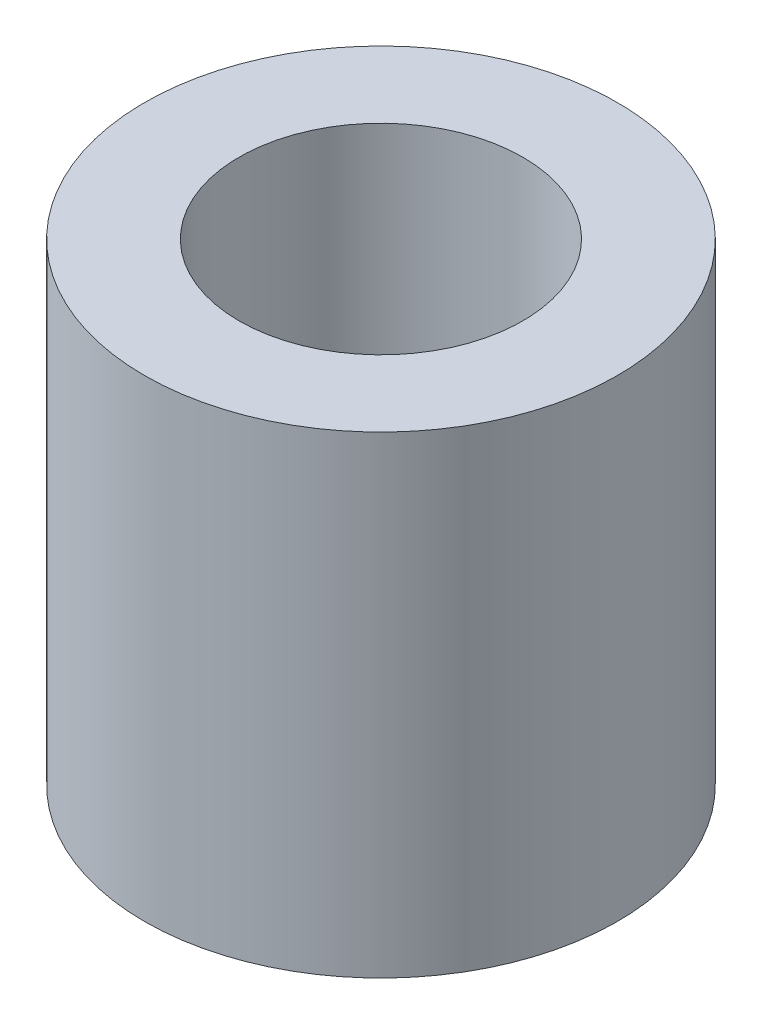
ISO-10303-21;
HEADER;
FILE_DESCRIPTION(('STEP AP214'),'2;1');
FILE_NAME('part.step','',(''),(''),'','','');
FILE_SCHEMA(('AUTOMOTIVE_DESIGN { 1 0 10303 214 1 1 1 1 }'));
ENDSEC;
DATA;
#1=APPLICATION_CONTEXT('core data for automotive mechanical design processes');
#2=APPLICATION_PROTOCOL_DEFINITION('international standard','automotive_design',2000,#1);
#3=PRODUCT_CONTEXT('',#1,'mechanical');
#4=PRODUCT('Part','Part','',(#3));
#5=PRODUCT_RELATED_PRODUCT_CATEGORY('part','',(#4));
#6=PRODUCT_DEFINITION_FORMATION('','',#4);
#7=PRODUCT_DEFINITION_CONTEXT('part definition',#1,'design');
#8=PRODUCT_DEFINITION('design','',#6,#7);
#9=PRODUCT_DEFINITION_SHAPE('','',#8);
#10=(LENGTH_UNIT() NAMED_UNIT(*) SI_UNIT(.MILLI.,.METRE.));
#11=(NAMED_UNIT(*) PLANE_ANGLE_UNIT() SI_UNIT($,.RADIAN.));
#12=(NAMED_UNIT(*) SI_UNIT($,.STERADIAN.) SOLID_ANGLE_UNIT());
#13=UNCERTAINTY_MEASURE_WITH_UNIT(LENGTH_MEASURE(1.E-05),#10,'distance_accuracy_value','');
#14=(GEOMETRIC_REPRESENTATION_CONTEXT(3) GLOBAL_UNCERTAINTY_ASSIGNED_CONTEXT((#13)) GLOBAL_UNIT_ASSIGNED_CONTEXT((#10,
#11,#12)) REPRESENTATION_CONTEXT('',''));
#15=CARTESIAN_POINT('',(0.,0.,0.));
#16=DIRECTION('',(0.,0.,1.));
#17=DIRECTION('',(1.,0.,0.));
#18=AXIS2_PLACEMENT_3D('',#15,#16,#17);
#19=CARTESIAN_POINT('',(0.,2.5,0.));
#20=DIRECTION('',(0.,1.,0.));
#21=DIRECTION('',(0.,0.,1.));
#22=AXIS2_PLACEMENT_3D('',#19,#20,#21);
#23=PLANE('',#22);
#24=CARTESIAN_POINT('',(0.,2.5,0.));
#25=DIRECTION('',(0.,1.,0.));
#26=DIRECTION('',(0.,0.,1.));
#27=AXIS2_PLACEMENT_3D('',#24,#25,#26);
#28=CIRCLE('',#27,2.5);
#29=CARTESIAN_POINT('',(0.,2.5,2.5));
#30=VERTEX_POINT('',#29);
#31=EDGE_CURVE('E10',#30,#30,#28,.T.);
#32=ORIENTED_EDGE('',*,*,#31,.T.);
#33=EDGE_LOOP('',(#32));
#34=FACE_BOUND('',#33,.T.);
#35=CARTESIAN_POINT('',(0.,2.5,0.));
#36=DIRECTION('',(0.,1.,0.));
#37=DIRECTION('',(0.,0.,1.));
#38=AXIS2_PLACEMENT_3D('',#35,#36,#37);
#39=CIRCLE('',#38,1.5);
#40=CARTESIAN_POINT('',(0.,2.5,1.5));
#41=VERTEX_POINT('',#40);
#42=EDGE_CURVE('E41',#41,#41,#39,.T.);
#43=ORIENTED_EDGE('',*,*,#42,.F.);
#44=EDGE_LOOP('',(#43));
#45=FACE_BOUND('',#44,.T.);
#46=ADVANCED_FACE('F30',(#34,#45),#23,.T.);
#47=CARTESIAN_POINT('',(0.,-2.5,0.));
#48=DIRECTION('',(0.,1.,0.));
#49=DIRECTION('',(0.,0.,1.));
#50=AXIS2_PLACEMENT_3D('',#47,#48,#49);
#51=PLANE('',#50);
#52=CARTESIAN_POINT('',(0.,-2.5,0.));
#53=DIRECTION('',(0.,1.,0.));
#54=DIRECTION('',(0.,0.,1.));
#55=AXIS2_PLACEMENT_3D('',#52,#53,#54);
#56=CIRCLE('',#55,2.5);
#57=CARTESIAN_POINT('',(0.,-2.5,2.5));
#58=VERTEX_POINT('',#57);
#59=EDGE_CURVE('E34',#58,#58,#56,.T.);
#60=ORIENTED_EDGE('',*,*,#59,.F.);
#61=EDGE_LOOP('',(#60));
#62=FACE_BOUND('',#61,.T.);
#63=CARTESIAN_POINT('',(0.,-2.5,0.));
#64=DIRECTION('',(0.,1.,0.));
#65=DIRECTION('',(0.,0.,1.));
#66=AXIS2_PLACEMENT_3D('',#63,#64,#65);
#67=CIRCLE('',#66,1.5);
#68=CARTESIAN_POINT('',(0.,-2.5,1.5));
#69=VERTEX_POINT('',#68);
#70=EDGE_CURVE('E43',#69,#69,#67,.T.);
#71=ORIENTED_EDGE('',*,*,#70,.T.);
#72=EDGE_LOOP('',(#71));
#73=FACE_BOUND('',#72,.T.);
#74=ADVANCED_FACE('F53',(#62,#73),#51,.F.);
#75=CARTESIAN_POINT('',(0.,2.5,0.));
#76=DIRECTION('',(0.,-1.,0.));
#77=DIRECTION('',(0.,0.,-1.));
#78=AXIS2_PLACEMENT_3D('',#75,#76,#77);
#79=CYLINDRICAL_SURFACE('',#78,2.5);
#80=ORIENTED_EDGE('',*,*,#31,.F.);
#81=EDGE_LOOP('',(#80));
#82=FACE_BOUND('',#81,.T.);
#83=ORIENTED_EDGE('',*,*,#59,.T.);
#84=EDGE_LOOP('',(#83));
#85=FACE_BOUND('',#84,.T.);
#86=ADVANCED_FACE('F32',(#82,#85),#79,.T.);
#87=CARTESIAN_POINT('',(0.,2.5,0.));
#88=DIRECTION('',(0.,-1.,0.));
#89=DIRECTION('',(0.,0.,-1.));
#90=AXIS2_PLACEMENT_3D('',#87,#88,#89);
#91=CYLINDRICAL_SURFACE('',#90,1.5);
#92=ORIENTED_EDGE('',*,*,#42,.T.);
#93=EDGE_LOOP('',(#92));
#94=FACE_BOUND('',#93,.T.);
#95=ORIENTED_EDGE('',*,*,#70,.F.);
#96=EDGE_LOOP('',(#95));
#97=FACE_BOUND('',#96,.T.);
#98=ADVANCED_FACE('F49',(#94,#97),#91,.F.);
#99=CLOSED_SHELL('',(#46,#74,#86,#98));
#100=MANIFOLD_SOLID_BREP('B2',#99);
#101=ADVANCED_BREP_SHAPE_REPRESENTATION('',(#18,#100),#14);
#102=SHAPE_DEFINITION_REPRESENTATION(#9,#101);
ENDSEC;
END-ISO-10303-21;
